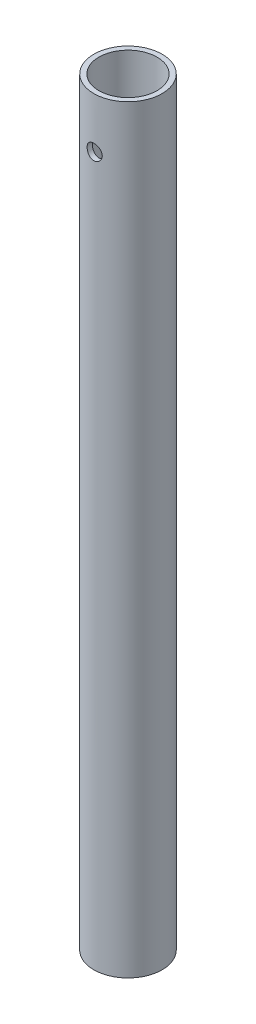
ISO-10303-21;
HEADER;
FILE_DESCRIPTION(('STEP AP214'),'2;1');
FILE_NAME('part.step','',(''),(''),'','','');
FILE_SCHEMA(('AUTOMOTIVE_DESIGN { 1 0 10303 214 1 1 1 1 }'));
ENDSEC;
DATA;
#1=APPLICATION_CONTEXT('core data for automotive mechanical design processes');
#2=APPLICATION_PROTOCOL_DEFINITION('international standard','automotive_design',2000,#1);
#3=PRODUCT_CONTEXT('',#1,'mechanical');
#4=PRODUCT('Part','Part','',(#3));
#5=PRODUCT_RELATED_PRODUCT_CATEGORY('part','',(#4));
#6=PRODUCT_DEFINITION_FORMATION('','',#4);
#7=PRODUCT_DEFINITION_CONTEXT('part definition',#1,'design');
#8=PRODUCT_DEFINITION('design','',#6,#7);
#9=PRODUCT_DEFINITION_SHAPE('','',#8);
#10=(LENGTH_UNIT() NAMED_UNIT(*) SI_UNIT(.MILLI.,.METRE.));
#11=(NAMED_UNIT(*) PLANE_ANGLE_UNIT() SI_UNIT($,.RADIAN.));
#12=(NAMED_UNIT(*) SI_UNIT($,.STERADIAN.) SOLID_ANGLE_UNIT());
#13=UNCERTAINTY_MEASURE_WITH_UNIT(LENGTH_MEASURE(1.E-05),#10,'distance_accuracy_value','');
#14=(GEOMETRIC_REPRESENTATION_CONTEXT(3) GLOBAL_UNCERTAINTY_ASSIGNED_CONTEXT((#13)) GLOBAL_UNIT_ASSIGNED_CONTEXT((#10,
#11,#12)) REPRESENTATION_CONTEXT('',''));
#15=CARTESIAN_POINT('',(0.,0.,0.));
#16=DIRECTION('',(0.,0.,1.));
#17=DIRECTION('',(1.,0.,0.));
#18=AXIS2_PLACEMENT_3D('',#15,#16,#17);
#19=CARTESIAN_POINT('',(0.,300.,0.));
#20=DIRECTION('',(0.,-1.,0.));
#21=DIRECTION('',(0.,0.,-1.));
#22=AXIS2_PLACEMENT_3D('',#19,#20,#21);
#23=CYLINDRICAL_SURFACE('',#22,13.5);
#24=CARTESIAN_POINT('',(0.,283.,-13.5));
#25=CARTESIAN_POINT('',(-0.166320715163475,282.99999441448,-13.4999969432738));
#26=CARTESIAN_POINT('',(-0.332708347904435,282.986122027505,-13.4968952099353));
#27=CARTESIAN_POINT('',(-0.660752916154707,282.931059291474,-13.4848214663651));
#28=CARTESIAN_POINT('',(-0.822406462708486,282.889849848986,-13.4758453532603));
#29=CARTESIAN_POINT('',(-1.1361949166423,282.781471044262,-13.453021697535));
#30=CARTESIAN_POINT('',(-1.28833972815044,282.714329234503,-13.4391793265858));
#31=CARTESIAN_POINT('',(-1.57920027047067,282.556080081291,-13.4081150316211));
#32=CARTESIAN_POINT('',(-1.71791626190004,282.464973203064,-13.3908931732119));
#33=CARTESIAN_POINT('',(-1.98027947102105,282.25978650234,-13.3546364126116));
#34=CARTESIAN_POINT('',(-2.10367291806528,282.145386246797,-13.3355784246157));
#35=CARTESIAN_POINT('',(-2.32968736568757,281.89754790986,-13.2979590162026));
#36=CARTESIAN_POINT('',(-2.4323064661629,281.764108088934,-13.2793976413422));
#37=CARTESIAN_POINT('',(-2.6149866511552,281.480092233913,-13.2446449239039));
#38=CARTESIAN_POINT('',(-2.6947761315658,281.32933756294,-13.2284831360632));
#39=CARTESIAN_POINT('',(-2.82778948431788,281.016140857459,-13.2006914453675));
#40=CARTESIAN_POINT('',(-2.88101664330239,280.853700271736,-13.189060981876));
#41=CARTESIAN_POINT('',(-2.95855287009672,280.524499784017,-13.171884141588));
#42=CARTESIAN_POINT('',(-2.98331200556964,280.357850927356,-13.1662431860067));
#43=CARTESIAN_POINT('',(-3.0046090649635,280.022676673338,-13.161400104853));
#44=CARTESIAN_POINT('',(-3.00115057367518,279.854151517065,-13.1621971613899));
#45=CARTESIAN_POINT('',(-2.96647241276003,279.523365059208,-13.1700544825106));
#46=CARTESIAN_POINT('',(-2.9357769669034,279.361045563791,-13.1769964708499));
#47=CARTESIAN_POINT('',(-2.84832736021706,279.043919285013,-13.1961743127978));
#48=CARTESIAN_POINT('',(-2.79157169522474,278.889112935872,-13.2084104719768));
#49=CARTESIAN_POINT('',(-2.65313509309314,278.589940842427,-13.2369136495754));
#50=CARTESIAN_POINT('',(-2.57125379069028,278.445671008996,-13.253212865443));
#51=CARTESIAN_POINT('',(-2.38503102209773,278.172725694226,-13.2879860686555));
#52=CARTESIAN_POINT('',(-2.28068640111411,278.04405240727,-13.3064603613074));
#53=CARTESIAN_POINT('',(-2.04973025554474,277.802936035977,-13.3440086191915));
#54=CARTESIAN_POINT('',(-1.92267330789934,277.690919822342,-13.3630867603185));
#55=CARTESIAN_POINT('',(-1.65135992713742,277.489714406639,-13.3993175868343));
#56=CARTESIAN_POINT('',(-1.50710316275605,277.400525644327,-13.4164702351263));
#57=CARTESIAN_POINT('',(-1.2049547861021,277.247396086335,-13.4469759635042));
#58=CARTESIAN_POINT('',(-1.04703318347978,277.183512633538,-13.4603203951149));
#59=CARTESIAN_POINT('',(-0.72233389647218,277.083308480413,-13.4816420454938));
#60=CARTESIAN_POINT('',(-0.555557546390043,277.046983639879,-13.4896200704518));
#61=CARTESIAN_POINT('',(-0.22154322492126,277.003551980117,-13.4991947664251));
#62=CARTESIAN_POINT('',(-0.0543845959783498,276.995862249757,-13.5009187293343));
#63=CARTESIAN_POINT('',(0.278828885892125,277.00833715639,-13.498148379759));
#64=CARTESIAN_POINT('',(0.444883815405972,277.028499839979,-13.4936545033569));
#65=CARTESIAN_POINT('',(0.769234885994143,277.095624122752,-13.4790338813792));
#66=CARTESIAN_POINT('',(0.927597737573245,277.142278684335,-13.4689717051164));
#67=CARTESIAN_POINT('',(1.23424920878376,277.260720531168,-13.4443413163019));
#68=CARTESIAN_POINT('',(1.38253695001527,277.332510004459,-13.4297727114699));
#69=CARTESIAN_POINT('',(1.66722965984157,277.500389315198,-13.3974322984146));
#70=CARTESIAN_POINT('',(1.80342859624838,277.596819914509,-13.3796166688537));
#71=CARTESIAN_POINT('',(2.0579204474822,277.810796873652,-13.3428454852362));
#72=CARTESIAN_POINT('',(2.1762109526012,277.928346070498,-13.3238897782526));
#73=CARTESIAN_POINT('',(2.39384322286479,278.183902050371,-13.2865331841872));
#74=CARTESIAN_POINT('',(2.49278072910112,278.32225613501,-13.2681497649643));
#75=CARTESIAN_POINT('',(2.6660191788413,278.613958051616,-13.2344309306746));
#76=CARTESIAN_POINT('',(2.74032119890461,278.767305228013,-13.2190953824291));
#77=CARTESIAN_POINT('',(2.86167002844388,279.083812433658,-13.1933580082339));
#78=CARTESIAN_POINT('',(2.90887179532138,279.246910663403,-13.1829281948968));
#79=CARTESIAN_POINT('',(2.97513041487608,279.578986277294,-13.1681347454609));
#80=CARTESIAN_POINT('',(2.99419193577534,279.747962681539,-13.16377010321));
#81=CARTESIAN_POINT('',(3.00342534961565,280.082918317417,-13.1616660217347));
#82=CARTESIAN_POINT('',(2.99423869715899,280.24887926209,-13.1637794755519));
#83=CARTESIAN_POINT('',(2.94867415682531,280.57682456495,-13.1740599743632));
#84=CARTESIAN_POINT('',(2.91229661100358,280.738808973135,-13.1822269432055));
#85=CARTESIAN_POINT('',(2.81369729971114,281.053673680341,-13.2036214219729));
#86=CARTESIAN_POINT('',(2.75157174942678,281.206585475322,-13.2168300777415));
#87=CARTESIAN_POINT('',(2.6033215552251,281.49990998882,-13.2468264670359));
#88=CARTESIAN_POINT('',(2.51719431877788,281.640321354946,-13.2636145871495));
#89=CARTESIAN_POINT('',(2.32127038485833,281.907814913422,-13.29931564253));
#90=CARTESIAN_POINT('',(2.21101778266551,282.034558307384,-13.3182655705161));
#91=CARTESIAN_POINT('',(1.97089305891749,282.267955110897,-13.3559096126008));
#92=CARTESIAN_POINT('',(1.84101639935009,282.374603860763,-13.3746036664358));
#93=CARTESIAN_POINT('',(1.5632189559683,282.56616397438,-13.4099288958987));
#94=CARTESIAN_POINT('',(1.41507845495237,282.650762799602,-13.4265288524884));
#95=CARTESIAN_POINT('',(1.10634041966819,282.793724956272,-13.4554808755387));
#96=CARTESIAN_POINT('',(0.945753304969474,282.852109960069,-13.4678364490622));
#97=CARTESIAN_POINT('',(0.654207371594107,282.930762025415,-13.4847421936433));
#98=CARTESIAN_POINT('',(0.524807987852514,282.956676060499,-13.4904280353482));
#99=CARTESIAN_POINT('',(0.263619674841785,282.991296856459,-13.4980580618968));
#100=CARTESIAN_POINT('',(0.131830858339314,283.000004427253,-13.5000024228542));
#101=CARTESIAN_POINT('',(0.,283.,-13.5));
#102=B_SPLINE_CURVE_WITH_KNOTS('',3,(#24,#25,#26,#27,#28,#29,#30,#31,#32,#33,#34,#35,#36,#37,
#38,#39,#40,#41,#42,#43,#44,#45,#46,#47,#48,#49,#50,#51,#52,#53,#54,#55,#56,#57,#58,#59,#60,#61,
#62,#63,#64,#65,#66,#67,#68,#69,#70,#71,#72,#73,#74,#75,#76,#77,#78,#79,#80,#81,#82,#83,#84,#85,
#86,#87,#88,#89,#90,#91,#92,#93,#94,#95,#96,#97,#98,#99,#100,#101),.UNSPECIFIED.,.T.,.F.,(4,2,2,
2,2,2,2,2,2,2,2,2,2,2,2,2,2,2,2,2,2,2,2,2,2,2,2,2,2,2,2,2,2,2,2,2,2,2,4),(0.,0.498479534594704,
0.997307596873934,1.49560711861119,1.99389696775484,2.49957108003119,3.0052914223577,
3.51679944446963,4.0282441603161,4.53148688459217,5.03466567749045,5.52836502222837,
6.02209286624578,6.51986504568535,7.01770717891614,7.52667269717627,8.03564801958903,
8.54577019221019,9.05581571257145,9.55541988190566,10.0549890137256,10.5488830414191,
11.0428200742235,11.5439970489723,12.045241400858,12.5560420966276,13.0668204676978,
13.5746483858703,14.0823920503378,14.5786917771778,15.0749852607845,15.5694406802783,
16.0639495288375,16.5687648947341,17.0736971770379,17.5854388057852,18.0967565681057,
18.49188521042,18.8869952533609),.UNSPECIFIED.);
#103=CARTESIAN_POINT('',(0.,283.,-13.5));
#104=VERTEX_POINT('',#103);
#105=EDGE_CURVE('E89',#104,#104,#102,.T.);
#106=ORIENTED_EDGE('',*,*,#105,.T.);
#107=EDGE_LOOP('',(#106));
#108=FACE_BOUND('',#107,.T.);
#109=CARTESIAN_POINT('',(2.99999999999999,280.,13.1624465810882));
#110=CARTESIAN_POINT('',(2.99999437421922,279.833736448426,13.162449939686));
#111=CARTESIAN_POINT('',(2.98613119718497,279.667405881012,13.1656311803976));
#112=CARTESIAN_POINT('',(2.93110835499427,279.339479760867,13.1779880857712));
#113=CARTESIAN_POINT('',(2.88992936552136,279.177887644876,13.187167994066));
#114=CARTESIAN_POINT('',(2.78163957468418,278.864229366595,13.2104323856515));
#115=CARTESIAN_POINT('',(2.71455775200913,278.712152778999,13.2245113863689));
#116=CARTESIAN_POINT('',(2.55645005152965,278.421407489414,13.2559809946233));
#117=CARTESIAN_POINT('',(2.46542450423716,278.282738602385,13.2733715564475));
#118=CARTESIAN_POINT('',(2.26032161188682,278.020326142947,13.3098435492506));
#119=CARTESIAN_POINT('',(2.14590554668826,277.89685035682,13.3289471973885));
#120=CARTESIAN_POINT('',(1.89800051829543,277.670675871341,13.3664985517074));
#121=CARTESIAN_POINT('',(1.76451004412271,277.567978819534,13.3849462057791));
#122=CARTESIAN_POINT('',(1.48044591785629,277.385213872907,13.4193493920259));
#123=CARTESIAN_POINT('',(1.32970232479956,277.30540412582,13.4352756511115));
#124=CARTESIAN_POINT('',(1.01652950347788,277.172350297419,13.4625903650323));
#125=CARTESIAN_POINT('',(0.854101632010398,277.119103137293,13.4739793457426));
#126=CARTESIAN_POINT('',(0.524956194492478,277.041529850592,13.4907792670088));
#127=CARTESIAN_POINT('',(0.358350342392857,277.016750336199,13.496283823904));
#128=CARTESIAN_POINT('',(0.0232614866790068,276.995397593691,13.5010192342806));
#129=CARTESIAN_POINT('',(-0.145221293214847,276.998821039099,13.5002508276442));
#130=CARTESIAN_POINT('',(-0.476153881401553,277.033440583744,13.4925982402692));
#131=CARTESIAN_POINT('',(-0.638657676490764,277.064147918637,13.4858216940701));
#132=CARTESIAN_POINT('',(-0.956146268315158,277.151684001333,13.4670371595346));
#133=CARTESIAN_POINT('',(-1.11113071761424,277.20851395488,13.4550289297202));
#134=CARTESIAN_POINT('',(-1.41053065408643,277.347110461151,13.4269580790848));
#135=CARTESIAN_POINT('',(-1.55485803134107,277.429061074817,13.4108656882919));
#136=CARTESIAN_POINT('',(-1.82788970481725,277.615435140923,13.3763890752603));
#137=CARTESIAN_POINT('',(-1.95659180494434,277.719861746605,13.3580045315994));
#138=CARTESIAN_POINT('',(-2.19762748437126,277.950880290779,13.3204974859024));
#139=CARTESIAN_POINT('',(-2.30955032771431,278.077899963956,13.3013676144021));
#140=CARTESIAN_POINT('',(-2.51058454530819,278.349104121426,13.2648948216275));
#141=CARTESIAN_POINT('',(-2.59969526023221,278.493289101661,13.2475519520106));
#142=CARTESIAN_POINT('',(-2.75276648873961,278.795409832523,13.2165965034763));
#143=CARTESIAN_POINT('',(-2.81664716161098,278.953387334207,13.2029958072444));
#144=CARTESIAN_POINT('',(-2.91682904284754,279.278209256923,13.1812277113555));
#145=CARTESIAN_POINT('',(-2.95313478255714,279.445052216286,13.1730594190277));
#146=CARTESIAN_POINT('',(-2.99649448350306,279.77910998059,13.1632636274194));
#147=CARTESIAN_POINT('',(-3.00414748151696,279.94624319656,13.1615022037629));
#148=CARTESIAN_POINT('',(-2.99160821136521,280.279397384444,13.1643579678824));
#149=CARTESIAN_POINT('',(-2.9714179228137,280.445418434588,13.1689747021814));
#150=CARTESIAN_POINT('',(-2.90428555984046,280.769535306245,13.1839399241269));
#151=CARTESIAN_POINT('',(-2.85767538981652,280.927703462944,13.1942172550355));
#152=CARTESIAN_POINT('',(-2.73938662708087,281.233984946693,13.2192811275877));
#153=CARTESIAN_POINT('',(-2.6677055716502,281.382097284249,13.2340681121974));
#154=CARTESIAN_POINT('',(-2.49999705249824,281.666649402665,13.2667781107747));
#155=CARTESIAN_POINT('',(-2.40360171706269,281.802866972477,13.2847471146597));
#156=CARTESIAN_POINT('',(-2.18968056440662,282.057412536113,13.3216761301978));
#157=CARTESIAN_POINT('',(-2.07215203429643,282.175738229543,13.340636268862));
#158=CARTESIAN_POINT('',(-1.81658582192193,282.393477015263,13.3778540089087));
#159=CARTESIAN_POINT('',(-1.6781961147544,282.492481053804,13.3960909909727));
#160=CARTESIAN_POINT('',(-1.38640224321387,282.665836201351,13.4294236716516));
#161=CARTESIAN_POINT('',(-1.23299879221959,282.74018848095,13.4445195194113));
#162=CARTESIAN_POINT('',(-0.916502850004942,282.86156517195,13.4697823307937));
#163=CARTESIAN_POINT('',(-0.753480582261597,282.908765793841,13.4799810032788));
#164=CARTESIAN_POINT('',(-0.421567630193356,282.975047740025,13.4944376504927));
#165=CARTESIAN_POINT('',(-0.252677831887746,282.994133291071,13.4986965181926));
#166=CARTESIAN_POINT('',(0.082297268310596,283.003448173553,13.5007661280042));
#167=CARTESIAN_POINT('',(0.248365058604333,282.994287445989,13.4987131684573));
#168=CARTESIAN_POINT('',(0.576531062049253,282.948737574165,13.4886828969468));
#169=CARTESIAN_POINT('',(0.738629351014953,282.912348950357,13.480705698223));
#170=CARTESIAN_POINT('',(1.05376542717997,282.813672464208,13.4597345559667));
#171=CARTESIAN_POINT('',(1.20683232396083,282.751473664149,13.4467578748893));
#172=CARTESIAN_POINT('',(1.50043729213956,282.603028294691,13.4171713097671));
#173=CARTESIAN_POINT('',(1.64097410368606,282.51677931073,13.4005610609598));
#174=CARTESIAN_POINT('',(1.90849634926497,282.320706583805,13.365112239233));
#175=CARTESIAN_POINT('',(2.03516363758939,282.210455446466,13.3462364922944));
#176=CARTESIAN_POINT('',(2.26840759852961,281.970366795321,13.3085806076653));
#177=CARTESIAN_POINT('',(2.37497939998718,281.840524546315,13.2898004942272));
#178=CARTESIAN_POINT('',(2.56643776712977,281.562768250318,13.2541705524972));
#179=CARTESIAN_POINT('',(2.65100228786964,281.414628074889,13.2373511866028));
#180=CARTESIAN_POINT('',(2.79390039487001,281.105894656943,13.2079326027974));
#181=CARTESIAN_POINT('',(2.8522558615995,280.945311933841,13.195329866909));
#182=CARTESIAN_POINT('',(2.93084024198603,280.653840288917,13.1780643261061));
#183=CARTESIAN_POINT('',(2.95672473071977,280.52451485909,13.1722470677159));
#184=CARTESIAN_POINT('',(2.99130639255912,280.26347356513,13.1644369637272));
#185=CARTESIAN_POINT('',(3.00000445822691,280.131757825494,13.1624439195214));
#186=CARTESIAN_POINT('',(2.99999999999999,280.,13.1624465810882));
#187=B_SPLINE_CURVE_WITH_KNOTS('',3,(#109,#110,#111,#112,#113,#114,#115,#116,#117,#118,#119,
#120,#121,#122,#123,#124,#125,#126,#127,#128,#129,#130,#131,#132,#133,#134,#135,#136,#137,#138,
#139,#140,#141,#142,#143,#144,#145,#146,#147,#148,#149,#150,#151,#152,#153,#154,#155,#156,#157,
#158,#159,#160,#161,#162,#163,#164,#165,#166,#167,#168,#169,#170,#171,#172,#173,#174,#175,#176,
#177,#178,#179,#180,#181,#182,#183,#184,#185,#186),.UNSPECIFIED.,.T.,.F.,(4,2,2,2,2,2,2,2,2,2,2,
2,2,2,2,2,2,2,2,2,2,2,2,2,2,2,2,2,2,2,2,2,2,2,2,2,2,2,4),(0.,0.498307675530979,
0.996968250668867,1.4950725601167,1.99316999424377,2.49906890879468,3.00500792034459,
3.51644718964219,4.02782716534903,4.53094457218487,5.03400263829126,5.52822662761373,
6.02247343116049,6.52043187009748,7.01846021505131,7.52718070946971,8.03591590550603,
8.54624834175494,9.05649689774063,9.5560162427495,10.0555000745451,10.5488438692604,
11.0422361388693,11.5434484309064,12.0447251100686,12.5556756906531,13.0666020051728,
13.5741739418346,14.0816695635361,14.578283813479,15.0748885710505,15.5697937766901,
16.0647486871406,16.5693670418218,17.0741075594952,17.5858645730319,18.0971935515558,
18.4921047944899,18.886995527507),.UNSPECIFIED.);
#188=CARTESIAN_POINT('',(2.99999999999999,280.,13.1624465810882));
#189=VERTEX_POINT('',#188);
#190=EDGE_CURVE('E83',#189,#189,#187,.T.);
#191=ORIENTED_EDGE('',*,*,#190,.T.);
#192=EDGE_LOOP('',(#191));
#193=FACE_BOUND('',#192,.T.);
#194=CARTESIAN_POINT('',(0.,300.,0.));
#195=DIRECTION('',(0.,1.,0.));
#196=DIRECTION('',(0.,0.,1.));
#197=AXIS2_PLACEMENT_3D('',#194,#195,#196);
#198=CIRCLE('',#197,13.5);
#199=CARTESIAN_POINT('',(0.,300.,13.5));
#200=VERTEX_POINT('',#199);
#201=EDGE_CURVE('E10',#200,#200,#198,.T.);
#202=ORIENTED_EDGE('',*,*,#201,.F.);
#203=EDGE_LOOP('',(#202));
#204=FACE_BOUND('',#203,.T.);
#205=CARTESIAN_POINT('',(0.,0.,0.));
#206=DIRECTION('',(0.,1.,0.));
#207=DIRECTION('',(0.,0.,1.));
#208=AXIS2_PLACEMENT_3D('',#205,#206,#207);
#209=CIRCLE('',#208,13.5);
#210=CARTESIAN_POINT('',(0.,0.,13.5));
#211=VERTEX_POINT('',#210);
#212=EDGE_CURVE('E51',#211,#211,#209,.T.);
#213=ORIENTED_EDGE('',*,*,#212,.T.);
#214=EDGE_LOOP('',(#213));
#215=FACE_BOUND('',#214,.T.);
#216=ADVANCED_FACE('F37',(#108,#193,#204,#215),#23,.T.);
#217=CARTESIAN_POINT('',(0.,300.,0.));
#218=DIRECTION('',(0.,1.,0.));
#219=DIRECTION('',(0.,0.,1.));
#220=AXIS2_PLACEMENT_3D('',#217,#218,#219);
#221=PLANE('',#220);
#222=CARTESIAN_POINT('',(0.,300.,0.));
#223=DIRECTION('',(0.,1.,0.));
#224=DIRECTION('',(0.,0.,1.));
#225=AXIS2_PLACEMENT_3D('',#222,#223,#224);
#226=CIRCLE('',#225,11.5);
#227=CARTESIAN_POINT('',(0.,300.,11.5));
#228=VERTEX_POINT('',#227);
#229=EDGE_CURVE('E96',#228,#228,#226,.T.);
#230=ORIENTED_EDGE('',*,*,#229,.F.);
#231=EDGE_LOOP('',(#230));
#232=FACE_BOUND('',#231,.T.);
#233=ORIENTED_EDGE('',*,*,#201,.T.);
#234=EDGE_LOOP('',(#233));
#235=FACE_BOUND('',#234,.T.);
#236=ADVANCED_FACE('F116',(#232,#235),#221,.T.);
#237=CARTESIAN_POINT('',(0.,0.,0.));
#238=DIRECTION('',(0.,1.,0.));
#239=DIRECTION('',(0.,0.,1.));
#240=AXIS2_PLACEMENT_3D('',#237,#238,#239);
#241=PLANE('',#240);
#242=CARTESIAN_POINT('',(0.,0.,0.));
#243=DIRECTION('',(0.,-1.,0.));
#244=DIRECTION('',(0.,0.,-1.));
#245=AXIS2_PLACEMENT_3D('',#242,#243,#244);
#246=CIRCLE('',#245,3.);
#247=CARTESIAN_POINT('',(0.,0.,-3.));
#248=VERTEX_POINT('',#247);
#249=EDGE_CURVE('E60',#248,#248,#246,.T.);
#250=ORIENTED_EDGE('',*,*,#249,.F.);
#251=EDGE_LOOP('',(#250));
#252=FACE_BOUND('',#251,.T.);
#253=ORIENTED_EDGE('',*,*,#212,.F.);
#254=EDGE_LOOP('',(#253));
#255=FACE_BOUND('',#254,.T.);
#256=ADVANCED_FACE('F113',(#252,#255),#241,.F.);
#257=CARTESIAN_POINT('',(0.,15.,0.));
#258=DIRECTION('',(0.,-1.,0.));
#259=DIRECTION('',(0.,0.,-1.));
#260=AXIS2_PLACEMENT_3D('',#257,#258,#259);
#261=CYLINDRICAL_SURFACE('',#260,3.);
#262=CARTESIAN_POINT('',(0.,15.,0.));
#263=DIRECTION('',(0.,-1.,0.));
#264=DIRECTION('',(0.,0.,-1.));
#265=AXIS2_PLACEMENT_3D('',#262,#263,#264);
#266=CIRCLE('',#265,3.);
#267=CARTESIAN_POINT('',(0.,15.,-3.));
#268=VERTEX_POINT('',#267);
#269=EDGE_CURVE('E57',#268,#268,#266,.T.);
#270=ORIENTED_EDGE('',*,*,#269,.F.);
#271=EDGE_LOOP('',(#270));
#272=FACE_BOUND('',#271,.T.);
#273=ORIENTED_EDGE('',*,*,#249,.T.);
#274=EDGE_LOOP('',(#273));
#275=FACE_BOUND('',#274,.T.);
#276=ADVANCED_FACE('F111',(#272,#275),#261,.F.);
#277=CARTESIAN_POINT('',(0.,15.,0.));
#278=DIRECTION('',(0.,-1.,0.));
#279=DIRECTION('',(0.,0.,-1.));
#280=AXIS2_PLACEMENT_3D('',#277,#278,#279);
#281=PLANE('',#280);
#282=ORIENTED_EDGE('',*,*,#269,.T.);
#283=EDGE_LOOP('',(#282));
#284=FACE_BOUND('',#283,.T.);
#285=ADVANCED_FACE('F141',(#284),#281,.T.);
#286=CARTESIAN_POINT('',(0.,250.,0.));
#287=DIRECTION('',(0.,1.,0.));
#288=DIRECTION('',(0.,0.,1.));
#289=AXIS2_PLACEMENT_3D('',#286,#287,#288);
#290=CYLINDRICAL_SURFACE('',#289,11.5);
#291=CARTESIAN_POINT('',(0.,277.,11.5));
#292=CARTESIAN_POINT('',(0.165513100860296,277.000004193869,11.4999973842083));
#293=CARTESIAN_POINT('',(0.331071792667562,277.013743273118,11.4963914735785));
#294=CARTESIAN_POINT('',(0.657428520127659,277.068244631816,11.4823566903655));
#295=CARTESIAN_POINT('',(0.818224076801239,277.109020733259,11.4719243279672));
#296=CARTESIAN_POINT('',(1.13029583329107,277.216186741813,11.4453894360731));
#297=CARTESIAN_POINT('',(1.28158373259806,277.282544422574,11.4292940427894));
#298=CARTESIAN_POINT('',(1.57088220036602,277.438872613929,11.3931387395842));
#299=CARTESIAN_POINT('',(1.70889203618856,277.528844426449,11.3730786110885));
#300=CARTESIAN_POINT('',(1.97079048735202,277.731962893927,11.3306643466588));
#301=CARTESIAN_POINT('',(2.09434123783153,277.845537292703,11.3082723366706));
#302=CARTESIAN_POINT('',(2.32087548199197,278.09172209065,11.2639641792344));
#303=CARTESIAN_POINT('',(2.42385644673363,278.224334827037,11.2420480905931));
#304=CARTESIAN_POINT('',(2.60795448399084,278.507502695222,11.2007877833303));
#305=CARTESIAN_POINT('',(2.68868668283709,278.658315664657,11.1814914564911));
#306=CARTESIAN_POINT('',(2.82351791781963,278.971958518897,11.1482107465382));
#307=CARTESIAN_POINT('',(2.87762163115708,279.134786287562,11.1342254306624));
#308=CARTESIAN_POINT('',(2.95649405505279,279.464104153867,11.1135406198326));
#309=CARTESIAN_POINT('',(2.98187355292013,279.630438226375,11.1066896836805));
#310=CARTESIAN_POINT('',(3.00448073974605,279.965133428494,11.1005965593208));
#311=CARTESIAN_POINT('',(3.00171344526938,280.133494191548,11.1013530152577));
#312=CARTESIAN_POINT('',(2.96859135930545,280.462727097771,11.1102534515041));
#313=CARTESIAN_POINT('',(2.93897161445018,280.623679351878,11.1182005862931));
#314=CARTESIAN_POINT('',(2.85416102354823,280.938247099502,11.1402722789424));
#315=CARTESIAN_POINT('',(2.79896821228887,281.091862028167,11.1543973115509));
#316=CARTESIAN_POINT('',(2.66396957573278,281.389330012323,11.187409032741));
#317=CARTESIAN_POINT('',(2.58390285471209,281.533058876274,11.206345787518));
#318=CARTESIAN_POINT('',(2.40161136377509,281.805301197365,11.2468198684999));
#319=CARTESIAN_POINT('',(2.29938240245392,281.933811769248,11.2683576862857));
#320=CARTESIAN_POINT('',(2.07189255916667,282.176173736811,11.3124298554105));
#321=CARTESIAN_POINT('',(1.946013332897,282.289443673173,11.3349743481704));
#322=CARTESIAN_POINT('',(1.67677263038273,282.49338204645,11.3779167462408));
#323=CARTESIAN_POINT('',(1.53341052279567,282.58404966679,11.3983145739813));
#324=CARTESIAN_POINT('',(1.23239828878867,282.740450498798,11.4347820566352));
#325=CARTESIAN_POINT('',(1.07469319813241,282.806082315236,11.4508340362744));
#326=CARTESIAN_POINT('',(0.749974407216037,282.909736798065,11.4766732017882));
#327=CARTESIAN_POINT('',(0.58296265865195,282.947765229866,11.4864616958415));
#328=CARTESIAN_POINT('',(0.249336896290381,282.994229355038,11.4984746597007));
#329=CARTESIAN_POINT('',(0.0828401568193254,283.003456038793,11.5009012574177));
#330=CARTESIAN_POINT('',(-0.249320472000849,282.994233875309,11.4984962196045));
#331=CARTESIAN_POINT('',(-0.414984441848125,282.975787756713,11.4936652996928));
#332=CARTESIAN_POINT('',(-0.737980197972118,282.912393590792,11.4774182356358));
#333=CARTESIAN_POINT('',(-0.895403878510941,282.867883305153,11.4661109329236));
#334=CARTESIAN_POINT('',(-1.20053743045728,282.754129682298,11.4381906289645));
#335=CARTESIAN_POINT('',(-1.34824627123264,282.684883725907,11.4215770658761));
#336=CARTESIAN_POINT('',(-1.6328568872324,282.522133990814,11.384409691977));
#337=CARTESIAN_POINT('',(-1.76950082283841,282.42819538867,11.3637871788159));
#338=CARTESIAN_POINT('',(-2.02536444506459,282.219276784692,11.3209873982752));
#339=CARTESIAN_POINT('',(-2.14458083612579,282.104292812401,11.2988098380055));
#340=CARTESIAN_POINT('',(-2.36551255989495,281.852862344287,11.254661465243));
#341=CARTESIAN_POINT('',(-2.46667088847342,281.715921736014,11.2327122597983));
#342=CARTESIAN_POINT('',(-2.64457935536873,281.426548780205,11.192165018719));
#343=CARTESIAN_POINT('',(-2.72133054240005,281.274117098654,11.173566839114));
#344=CARTESIAN_POINT('',(-2.84766857265182,280.958874161589,11.1420386572547));
#345=CARTESIAN_POINT('',(-2.89741467502046,280.796130222908,11.1290755154597));
#346=CARTESIAN_POINT('',(-2.96872395986276,280.464194149466,11.1102683935593));
#347=CARTESIAN_POINT('',(-2.99029396995786,280.295003587079,11.1044226887823));
#348=CARTESIAN_POINT('',(-3.00425859429514,279.960667058519,11.1006519578976));
#349=CARTESIAN_POINT('',(-2.99754663404829,279.795560572966,11.1024843702272));
#350=CARTESIAN_POINT('',(-2.95720046555003,279.468921256042,11.1132980148306));
#351=CARTESIAN_POINT('',(-2.9235668945065,279.307388340182,11.1222790779029));
#352=CARTESIAN_POINT('',(-2.83083978633454,278.99355163356,11.146236908418));
#353=CARTESIAN_POINT('',(-2.77192786169538,278.841190686007,11.1611708539899));
#354=CARTESIAN_POINT('',(-2.63045811008316,278.548402101522,11.1953544983421));
#355=CARTESIAN_POINT('',(-2.54789672232777,278.407976265733,11.214604846927));
#356=CARTESIAN_POINT('',(-2.35873097869855,278.138760703335,11.2559316488901));
#357=CARTESIAN_POINT('',(-2.25151328856474,278.010411775057,11.2780725776048));
#358=CARTESIAN_POINT('',(-2.01725513432176,277.773237177605,11.3223171566295));
#359=CARTESIAN_POINT('',(-1.89020990005613,277.664416220094,11.3444207966715));
#360=CARTESIAN_POINT('',(-1.61680516286454,277.467231223212,11.3866339966214));
#361=CARTESIAN_POINT('',(-1.47010728053367,277.379324940827,11.4066942425439));
#362=CARTESIAN_POINT('',(-1.16350012002821,277.229560878787,11.4420280888707));
#363=CARTESIAN_POINT('',(-1.00359975967307,277.167685685455,11.45730488744));
#364=CARTESIAN_POINT('',(-0.703483555588745,277.080208412839,11.4792739930824));
#365=CARTESIAN_POINT('',(-0.564611293459962,277.050198371887,11.4869907732114));
#366=CARTESIAN_POINT('',(-0.283837014202423,277.010093262381,11.4973546703827));
#367=CARTESIAN_POINT('',(-0.141935270594586,276.99999640356,11.5000022431645));
#368=CARTESIAN_POINT('',(0.,277.,11.5));
#369=B_SPLINE_CURVE_WITH_KNOTS('',3,(#291,#292,#293,#294,#295,#296,#297,#298,#299,#300,#301,
#302,#303,#304,#305,#306,#307,#308,#309,#310,#311,#312,#313,#314,#315,#316,#317,#318,#319,#320,
#321,#322,#323,#324,#325,#326,#327,#328,#329,#330,#331,#332,#333,#334,#335,#336,#337,#338,#339,
#340,#341,#342,#343,#344,#345,#346,#347,#348,#349,#350,#351,#352,#353,#354,#355,#356,#357,#358,
#359,#360,#361,#362,#363,#364,#365,#366,#367,#368),.UNSPECIFIED.,.T.,.F.,(4,2,2,2,2,2,2,2,2,2,2,
2,2,2,2,2,2,2,2,2,2,2,2,2,2,2,2,2,2,2,2,2,2,2,2,2,2,2,4),(0.,0.496018922637779,
0.992291618127644,1.48794116718855,1.98361804884228,2.48921443639201,2.99487294596053,
3.50879636483805,4.02262948260498,4.52531823554623,5.02791739652052,5.51716080841055,
6.0064418234118,6.50103868312975,6.995729164565,7.50583207603591,8.01595341381997,
8.52811935034123,9.0401782819935,9.53804479083301,10.0358622113971,10.5255490579065,
11.0152877710096,11.5143071256334,12.0134207233813,12.5259596313799,13.0384765138731,
13.5479371169049,14.0572742446951,14.5506440866167,15.0440022513079,15.533873717558,
16.0238189801283,16.5276054380276,17.0315132854091,17.5456025841074,18.0593474302638,
18.4847452383112,18.9101047998124),.UNSPECIFIED.);
#370=CARTESIAN_POINT('',(0.,277.,11.5));
#371=VERTEX_POINT('',#370);
#372=EDGE_CURVE('E41',#371,#371,#369,.T.);
#373=ORIENTED_EDGE('',*,*,#372,.T.);
#374=EDGE_LOOP('',(#373));
#375=FACE_BOUND('',#374,.T.);
#376=CARTESIAN_POINT('',(2.99999999999999,280.,-11.1018016555873));
#377=CARTESIAN_POINT('',(2.999995747819,279.834594976238,-11.1018046416681));
#378=CARTESIAN_POINT('',(2.9862739870282,279.669144245437,-11.1055385888146));
#379=CARTESIAN_POINT('',(2.93184764187598,279.343011428173,-11.1200285885836));
#380=CARTESIAN_POINT('',(2.89112875740955,279.182331916127,-11.1307883626702));
#381=CARTESIAN_POINT('',(2.78412993626241,278.870506352929,-11.1580303325578));
#382=CARTESIAN_POINT('',(2.71788489213753,278.719347614254,-11.1745047138183));
#383=CARTESIAN_POINT('',(2.5618224702582,278.430268171482,-11.2113097714373));
#384=CARTESIAN_POINT('',(2.47200355242806,278.292348333085,-11.2316406997192));
#385=CARTESIAN_POINT('',(2.26904416505211,278.030359319923,-11.2744133805517));
#386=CARTESIAN_POINT('',(2.15544151418967,277.906654015616,-11.2968912629679));
#387=CARTESIAN_POINT('',(1.90913395855512,277.679818344607,-11.3411127618239));
#388=CARTESIAN_POINT('',(1.77642714622369,277.576690034983,-11.3628563046717));
#389=CARTESIAN_POINT('',(1.49316595449649,277.392428604975,-11.4035611707643));
#390=CARTESIAN_POINT('',(1.34236981412247,277.311655711906,-11.4224748964669));
#391=CARTESIAN_POINT('',(1.02876288500971,277.176744726518,-11.4549753491794));
#392=CARTESIAN_POINT('',(0.865954036804379,277.122602343091,-11.4685629343453));
#393=CARTESIAN_POINT('',(0.536739673077883,277.043662617854,-11.4886247015949));
#394=CARTESIAN_POINT('',(0.370491769984357,277.018246676586,-11.4952486120864));
#395=CARTESIAN_POINT('',(0.035968674216289,276.995536662589,-11.5011595838329));
#396=CARTESIAN_POINT('',(-0.132306188861198,276.99823807784,-11.5004478222506));
#397=CARTESIAN_POINT('',(-0.461806253219216,277.031247177049,-11.4918779731592));
#398=CARTESIAN_POINT('',(-0.623103567895733,277.060886742158,-11.484192846204));
#399=CARTESIAN_POINT('',(-0.938350753963769,277.145853346413,-11.4627429057779));
#400=CARTESIAN_POINT('',(-1.09230021522685,277.20118181757,-11.4489777533824));
#401=CARTESIAN_POINT('',(-1.39020655404975,277.336477778892,-11.4166550310123));
#402=CARTESIAN_POINT('',(-1.53405298132856,277.416677311581,-11.3980526058452));
#403=CARTESIAN_POINT('',(-1.80647599780601,277.599261478559,-11.3580645092186));
#404=CARTESIAN_POINT('',(-1.93504971548295,277.701650274607,-11.3366783159438));
#405=CARTESIAN_POINT('',(-2.17726444915336,277.929265707489,-11.2927027234436));
#406=CARTESIAN_POINT('',(-2.29035502483112,278.055075489049,-11.2700964360244));
#407=CARTESIAN_POINT('',(-2.49396302118491,278.324109570273,-11.2267989241084));
#408=CARTESIAN_POINT('',(-2.58447918487125,278.467334839007,-11.2061078062925));
#409=CARTESIAN_POINT('',(-2.74076407552192,278.768287284465,-11.1689181104159));
#410=CARTESIAN_POINT('',(-2.80638929275417,278.926092223234,-11.1524440176527));
#411=CARTESIAN_POINT('',(-2.91000121073619,279.251031034071,-11.1258611172956));
#412=CARTESIAN_POINT('',(-2.94799442845879,279.418162696423,-11.1157508088869));
#413=CARTESIAN_POINT('',(-2.9943276367209,279.751878109492,-11.1033582796576));
#414=CARTESIAN_POINT('',(-3.00348615748076,279.918340322841,-11.1008600430728));
#415=CARTESIAN_POINT('',(-2.99414013174872,280.250416590673,-11.1033845712935));
#416=CARTESIAN_POINT('',(-2.97563838642952,280.416030729337,-11.1084065745196));
#417=CARTESIAN_POINT('',(-2.91221727119861,280.738596688021,-11.1251976544441));
#418=CARTESIAN_POINT('',(-2.86778442782072,280.895651265016,-11.1368423739405));
#419=CARTESIAN_POINT('',(-2.75430673419543,281.20008034189,-11.1654465443306));
#420=CARTESIAN_POINT('',(-2.68525877350582,281.347453615619,-11.1824066668623));
#421=CARTESIAN_POINT('',(-2.52283092439207,281.631776739358,-11.2201780868576));
#422=CARTESIAN_POINT('',(-2.42896728020132,281.768440193303,-11.241063253276));
#423=CARTESIAN_POINT('',(-2.22017639835017,282.024377105153,-11.2841551264166));
#424=CARTESIAN_POINT('',(-2.10524537788256,282.143647433075,-11.3063620699895));
#425=CARTESIAN_POINT('',(-1.85380657439173,282.364781103248,-11.3503349067264));
#426=CARTESIAN_POINT('',(-1.71679215074343,282.466075246861,-11.3720718556128));
#427=CARTESIAN_POINT('',(-1.42722696916736,282.644222569738,-11.4120266295759));
#428=CARTESIAN_POINT('',(-1.27467703578644,282.721077045246,-11.4302446412716));
#429=CARTESIAN_POINT('',(-0.959441437408487,282.84747001751,-11.4609920323941));
#430=CARTESIAN_POINT('',(-0.79684096186003,282.897210303713,-11.4735633090077));
#431=CARTESIAN_POINT('',(-0.465214293017997,282.968556188355,-11.491784860586));
#432=CARTESIAN_POINT('',(-0.296189465827475,282.990167734147,-11.4974365985569));
#433=CARTESIAN_POINT('',(0.0381598942663538,283.004283468778,-11.501116503245));
#434=CARTESIAN_POINT('',(0.203447203040753,282.99762435201,-11.4993638178306));
#435=CARTESIAN_POINT('',(0.530462632714381,282.957321185366,-11.4889239903936));
#436=CARTESIAN_POINT('',(0.692190876930549,282.923678071967,-11.4802370890226));
#437=CARTESIAN_POINT('',(1.00653701523354,282.830826644493,-11.456945044609));
#438=CARTESIAN_POINT('',(1.15920611864887,282.771781583779,-11.4423777301083));
#439=CARTESIAN_POINT('',(1.45255760125082,282.62994871993,-11.4088517835094));
#440=CARTESIAN_POINT('',(1.5932383535686,282.547157701004,-11.3898925567045));
#441=CARTESIAN_POINT('',(1.86254087988202,282.357697787997,-11.3490080955884));
#442=CARTESIAN_POINT('',(1.99075942238903,282.250469510894,-11.3270191162385));
#443=CARTESIAN_POINT('',(2.22766629387466,282.016248722094,-11.2828213186979));
#444=CARTESIAN_POINT('',(2.33634954498917,281.889251087654,-11.2606124449277));
#445=CARTESIAN_POINT('',(2.53333126849173,281.61591948099,-11.2179598882197));
#446=CARTESIAN_POINT('',(2.62115899195101,281.469238412496,-11.1975624999878));
#447=CARTESIAN_POINT('',(2.77078042280793,281.162679024461,-11.1614846462572));
#448=CARTESIAN_POINT('',(2.83259184668349,281.002809774771,-11.1458009729192));
#449=CARTESIAN_POINT('',(2.91993765526438,280.702847427149,-11.1232017724301));
#450=CARTESIAN_POINT('',(2.94989236706589,280.564104349136,-11.1152400200808));
#451=CARTESIAN_POINT('',(2.98992433717077,280.28358517006,-11.1045389509216));
#452=CARTESIAN_POINT('',(3.00000364559158,280.141809383342,-11.101799095482));
#453=CARTESIAN_POINT('',(2.99999999999999,280.,-11.1018016555873));
#454=B_SPLINE_CURVE_WITH_KNOTS('',3,(#376,#377,#378,#379,#380,#381,#382,#383,#384,#385,#386,
#387,#388,#389,#390,#391,#392,#393,#394,#395,#396,#397,#398,#399,#400,#401,#402,#403,#404,#405,
#406,#407,#408,#409,#410,#411,#412,#413,#414,#415,#416,#417,#418,#419,#420,#421,#422,#423,#424,
#425,#426,#427,#428,#429,#430,#431,#432,#433,#434,#435,#436,#437,#438,#439,#440,#441,#442,#443,
#444,#445,#446,#447,#448,#449,#450,#451,#452,#453),.UNSPECIFIED.,.T.,.F.,(4,2,2,2,2,2,2,2,2,2,2,
2,2,2,2,2,2,2,2,2,2,2,2,2,2,2,2,2,2,2,2,2,2,2,2,2,2,2,4),(0.,0.495693864426962,
0.991650502901466,1.48693159303921,1.98224504783317,2.48826597989993,2.99433747348058,
3.50814299910033,4.02186570550594,4.52430149755161,5.0266566644722,5.51688263581216,
6.00713593772639,6.50210829427885,6.99717356700057,7.50680002907637,8.01645486186931,
8.52900500910673,9.04143423279156,9.53917954400054,10.0368744516405,10.5255187110588,
11.0142247389737,11.5132674061232,12.0123997681007,12.5252646912174,13.0381024082112,
13.5470694807036,14.0559289230968,14.54983487618,15.0437236890362,15.5344847111833,
16.0253122259277,16.5287641209491,17.0323466910099,17.5463982140932,18.0600991117908,
18.4851242500373,18.9101055452975),.UNSPECIFIED.);
#455=CARTESIAN_POINT('',(2.99999999999999,280.,-11.1018016555873));
#456=VERTEX_POINT('',#455);
#457=EDGE_CURVE('E62',#456,#456,#454,.T.);
#458=ORIENTED_EDGE('',*,*,#457,.T.);
#459=EDGE_LOOP('',(#458));
#460=FACE_BOUND('',#459,.T.);
#461=CARTESIAN_POINT('',(0.,250.,0.));
#462=DIRECTION('',(0.,1.,0.));
#463=DIRECTION('',(0.,0.,1.));
#464=AXIS2_PLACEMENT_3D('',#461,#462,#463);
#465=CIRCLE('',#464,11.5);
#466=CARTESIAN_POINT('',(0.,250.,11.5));
#467=VERTEX_POINT('',#466);
#468=EDGE_CURVE('E97',#467,#467,#465,.T.);
#469=ORIENTED_EDGE('',*,*,#468,.F.);
#470=EDGE_LOOP('',(#469));
#471=FACE_BOUND('',#470,.T.);
#472=ORIENTED_EDGE('',*,*,#229,.T.);
#473=EDGE_LOOP('',(#472));
#474=FACE_BOUND('',#473,.T.);
#475=ADVANCED_FACE('F68',(#375,#460,#471,#474),#290,.F.);
#476=CARTESIAN_POINT('',(0.,250.,0.));
#477=DIRECTION('',(0.,1.,0.));
#478=DIRECTION('',(0.,0.,1.));
#479=AXIS2_PLACEMENT_3D('',#476,#477,#478);
#480=PLANE('',#479);
#481=ORIENTED_EDGE('',*,*,#468,.T.);
#482=EDGE_LOOP('',(#481));
#483=FACE_BOUND('',#482,.T.);
#484=ADVANCED_FACE('F76',(#483),#480,.T.);
#485=CARTESIAN_POINT('',(0.,280.,-13.5));
#486=DIRECTION('',(0.,0.,1.));
#487=DIRECTION('',(1.,0.,0.));
#488=AXIS2_PLACEMENT_3D('',#485,#486,#487);
#489=CYLINDRICAL_SURFACE('',#488,3.);
#490=ORIENTED_EDGE('',*,*,#457,.F.);
#491=EDGE_LOOP('',(#490));
#492=FACE_BOUND('',#491,.T.);
#493=ORIENTED_EDGE('',*,*,#105,.F.);
#494=EDGE_LOOP('',(#493));
#495=FACE_BOUND('',#494,.T.);
#496=ADVANCED_FACE('F72',(#492,#495),#489,.F.);
#497=ORIENTED_EDGE('',*,*,#372,.F.);
#498=EDGE_LOOP('',(#497));
#499=FACE_BOUND('',#498,.T.);
#500=ORIENTED_EDGE('',*,*,#190,.F.);
#501=EDGE_LOOP('',(#500));
#502=FACE_BOUND('',#501,.T.);
#503=ADVANCED_FACE('F75',(#499,#502),#489,.F.);
#504=CLOSED_SHELL('',(#216,#236,#256,#276,#285,#475,#484,#496,#503));
#505=MANIFOLD_SOLID_BREP('B2',#504);
#506=ADVANCED_BREP_SHAPE_REPRESENTATION('',(#18,#505),#14);
#507=SHAPE_DEFINITION_REPRESENTATION(#9,#506);
ENDSEC;
END-ISO-10303-21;
